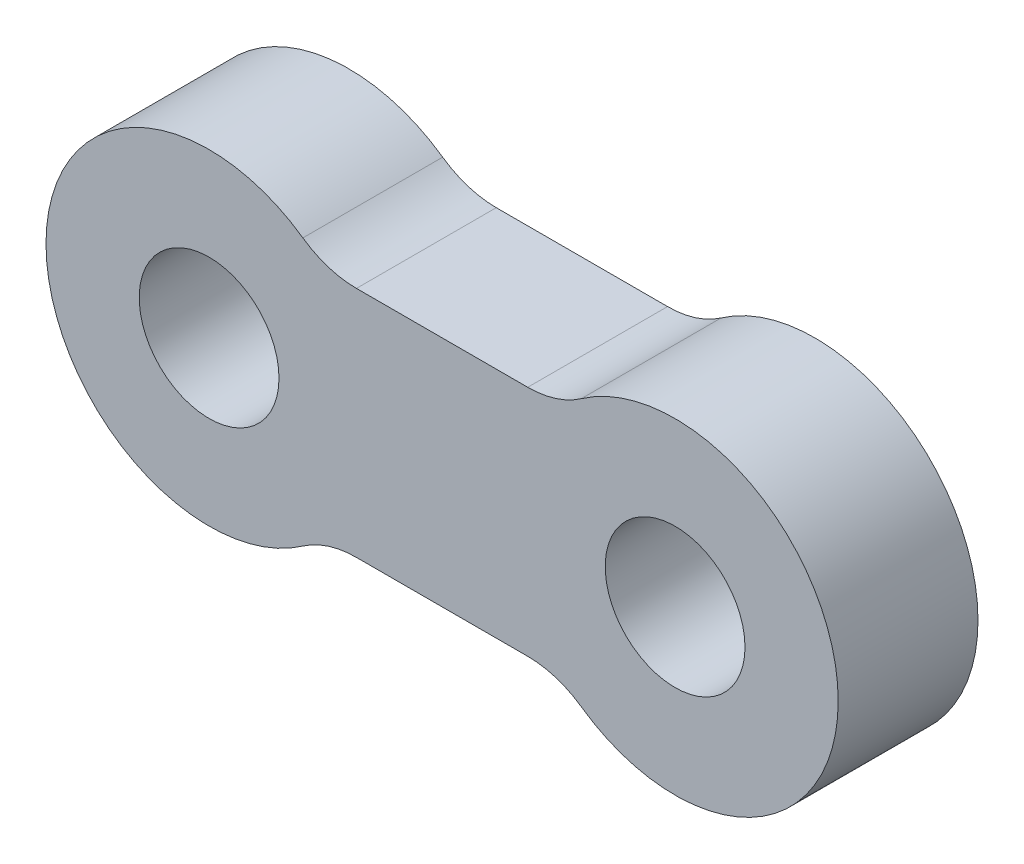
ISO-10303-21;
HEADER;
FILE_DESCRIPTION(('STEP AP214'),'2;1');
FILE_NAME('part.step','',(''),(''),'','','');
FILE_SCHEMA(('AUTOMOTIVE_DESIGN { 1 0 10303 214 1 1 1 1 }'));
ENDSEC;
DATA;
#1=APPLICATION_CONTEXT('core data for automotive mechanical design processes');
#2=APPLICATION_PROTOCOL_DEFINITION('international standard','automotive_design',2000,#1);
#3=PRODUCT_CONTEXT('',#1,'mechanical');
#4=PRODUCT('Part','Part','',(#3));
#5=PRODUCT_RELATED_PRODUCT_CATEGORY('part','',(#4));
#6=PRODUCT_DEFINITION_FORMATION('','',#4);
#7=PRODUCT_DEFINITION_CONTEXT('part definition',#1,'design');
#8=PRODUCT_DEFINITION('design','',#6,#7);
#9=PRODUCT_DEFINITION_SHAPE('','',#8);
#10=(LENGTH_UNIT() NAMED_UNIT(*) SI_UNIT(.MILLI.,.METRE.));
#11=(NAMED_UNIT(*) PLANE_ANGLE_UNIT() SI_UNIT($,.RADIAN.));
#12=(NAMED_UNIT(*) SI_UNIT($,.STERADIAN.) SOLID_ANGLE_UNIT());
#13=UNCERTAINTY_MEASURE_WITH_UNIT(LENGTH_MEASURE(1.E-05),#10,'distance_accuracy_value','');
#14=(GEOMETRIC_REPRESENTATION_CONTEXT(3) GLOBAL_UNCERTAINTY_ASSIGNED_CONTEXT((#13)) GLOBAL_UNIT_ASSIGNED_CONTEXT((#10,
#11,#12)) REPRESENTATION_CONTEXT('',''));
#15=CARTESIAN_POINT('',(0.,0.,0.));
#16=DIRECTION('',(0.,0.,1.));
#17=DIRECTION('',(1.,0.,0.));
#18=AXIS2_PLACEMENT_3D('',#15,#16,#17);
#19=CARTESIAN_POINT('',(6.83772233983162,-4.5,3.));
#20=DIRECTION('',(0.,0.,-1.));
#21=DIRECTION('',(-1.,0.,0.));
#22=AXIS2_PLACEMENT_3D('',#19,#20,#21);
#23=PLANE('',#22);
#24=CARTESIAN_POINT('',(6.83772233983162,-4.5,3.));
#25=DIRECTION('',(0.,0.,-1.));
#26=DIRECTION('',(-1.,0.,0.));
#27=AXIS2_PLACEMENT_3D('',#24,#25,#26);
#28=CIRCLE('',#27,2.);
#29=CARTESIAN_POINT('',(6.83772233983162,-2.5,3.));
#30=VERTEX_POINT('',#29);
#31=CARTESIAN_POINT('',(7.98764148898376,-2.86363636363636,3.));
#32=VERTEX_POINT('',#31);
#33=EDGE_CURVE('E147',#30,#32,#28,.T.);
#34=ORIENTED_EDGE('',*,*,#33,.T.);
#35=CARTESIAN_POINT('',(10.,0.,3.));
#36=DIRECTION('',(0.,0.,1.));
#37=DIRECTION('',(-1.,0.,0.));
#38=AXIS2_PLACEMENT_3D('',#35,#36,#37);
#39=CIRCLE('',#38,3.5);
#40=CARTESIAN_POINT('',(7.98764148898376,2.86363636363637,3.));
#41=VERTEX_POINT('',#40);
#42=EDGE_CURVE('E95',#32,#41,#39,.T.);
#43=ORIENTED_EDGE('',*,*,#42,.T.);
#44=CARTESIAN_POINT('',(6.83772233983162,4.5,3.));
#45=DIRECTION('',(0.,0.,-1.));
#46=DIRECTION('',(-1.,0.,0.));
#47=AXIS2_PLACEMENT_3D('',#44,#45,#46);
#48=CIRCLE('',#47,2.);
#49=CARTESIAN_POINT('',(6.83772233983162,2.5,3.));
#50=VERTEX_POINT('',#49);
#51=EDGE_CURVE('E162',#41,#50,#48,.T.);
#52=ORIENTED_EDGE('',*,*,#51,.T.);
#53=DIRECTION('',(-1.,0.,0.));
#54=VECTOR('',#53,1.);
#55=CARTESIAN_POINT('',(3.16227766016838,2.5,3.));
#56=LINE('',#55,#54);
#57=CARTESIAN_POINT('',(3.16227766016838,2.5,3.));
#58=VERTEX_POINT('',#57);
#59=EDGE_CURVE('E175',#50,#58,#56,.T.);
#60=ORIENTED_EDGE('',*,*,#59,.T.);
#61=CARTESIAN_POINT('',(3.16227766016838,4.5,3.));
#62=DIRECTION('',(0.,0.,-1.));
#63=DIRECTION('',(-1.,0.,0.));
#64=AXIS2_PLACEMENT_3D('',#61,#62,#63);
#65=CIRCLE('',#64,2.);
#66=CARTESIAN_POINT('',(2.01235851101624,2.86363636363636,3.));
#67=VERTEX_POINT('',#66);
#68=EDGE_CURVE('E114',#58,#67,#65,.T.);
#69=ORIENTED_EDGE('',*,*,#68,.T.);
#70=CARTESIAN_POINT('',(0.,0.,3.));
#71=DIRECTION('',(0.,0.,1.));
#72=DIRECTION('',(1.,0.,0.));
#73=AXIS2_PLACEMENT_3D('',#70,#71,#72);
#74=CIRCLE('',#73,3.5);
#75=CARTESIAN_POINT('',(2.01235851101624,-2.86363636363636,3.));
#76=VERTEX_POINT('',#75);
#77=EDGE_CURVE('E108',#67,#76,#74,.T.);
#78=ORIENTED_EDGE('',*,*,#77,.T.);
#79=CARTESIAN_POINT('',(3.16227766016838,-4.5,3.));
#80=DIRECTION('',(0.,0.,-1.));
#81=DIRECTION('',(1.,0.,0.));
#82=AXIS2_PLACEMENT_3D('',#79,#80,#81);
#83=CIRCLE('',#82,2.);
#84=CARTESIAN_POINT('',(3.16227766016838,-2.5,3.));
#85=VERTEX_POINT('',#84);
#86=EDGE_CURVE('E112',#76,#85,#83,.T.);
#87=ORIENTED_EDGE('',*,*,#86,.T.);
#88=DIRECTION('',(1.,0.,0.));
#89=VECTOR('',#88,1.);
#90=CARTESIAN_POINT('',(3.16227766016838,-2.5,3.));
#91=LINE('',#90,#89);
#92=EDGE_CURVE('E52',#85,#30,#91,.T.);
#93=ORIENTED_EDGE('',*,*,#92,.T.);
#94=EDGE_LOOP('',(#34,#43,#52,#60,#69,#78,#87,#93));
#95=FACE_BOUND('',#94,.T.);
#96=CARTESIAN_POINT('',(0.,0.,3.));
#97=DIRECTION('',(0.,0.,1.));
#98=DIRECTION('',(1.,0.,0.));
#99=AXIS2_PLACEMENT_3D('',#96,#97,#98);
#100=CIRCLE('',#99,1.5);
#101=CARTESIAN_POINT('',(1.5,0.,3.));
#102=VERTEX_POINT('',#101);
#103=EDGE_CURVE('E136',#102,#102,#100,.T.);
#104=ORIENTED_EDGE('',*,*,#103,.F.);
#105=EDGE_LOOP('',(#104));
#106=FACE_BOUND('',#105,.T.);
#107=CARTESIAN_POINT('',(10.,0.,3.));
#108=DIRECTION('',(0.,0.,1.));
#109=DIRECTION('',(1.,0.,0.));
#110=AXIS2_PLACEMENT_3D('',#107,#108,#109);
#111=CIRCLE('',#110,1.5);
#112=CARTESIAN_POINT('',(11.5,0.,3.));
#113=VERTEX_POINT('',#112);
#114=EDGE_CURVE('E184',#113,#113,#111,.T.);
#115=ORIENTED_EDGE('',*,*,#114,.F.);
#116=EDGE_LOOP('',(#115));
#117=FACE_BOUND('',#116,.T.);
#118=ADVANCED_FACE('F35',(#95,#106,#117),#23,.F.);
#119=CARTESIAN_POINT('',(6.83772233983162,-4.5,0.));
#120=DIRECTION('',(0.,0.,-1.));
#121=DIRECTION('',(-1.,0.,0.));
#122=AXIS2_PLACEMENT_3D('',#119,#120,#121);
#123=PLANE('',#122);
#124=CARTESIAN_POINT('',(0.,0.,0.));
#125=DIRECTION('',(0.,0.,1.));
#126=DIRECTION('',(1.,0.,0.));
#127=AXIS2_PLACEMENT_3D('',#124,#125,#126);
#128=CIRCLE('',#127,1.5);
#129=CARTESIAN_POINT('',(1.5,0.,0.));
#130=VERTEX_POINT('',#129);
#131=EDGE_CURVE('E181',#130,#130,#128,.T.);
#132=ORIENTED_EDGE('',*,*,#131,.T.);
#133=EDGE_LOOP('',(#132));
#134=FACE_BOUND('',#133,.T.);
#135=CARTESIAN_POINT('',(6.83772233983162,-4.5,0.));
#136=DIRECTION('',(0.,0.,-1.));
#137=DIRECTION('',(-1.,0.,0.));
#138=AXIS2_PLACEMENT_3D('',#135,#136,#137);
#139=CIRCLE('',#138,2.);
#140=CARTESIAN_POINT('',(6.83772233983162,-2.5,0.));
#141=VERTEX_POINT('',#140);
#142=CARTESIAN_POINT('',(7.98764148898376,-2.86363636363636,0.));
#143=VERTEX_POINT('',#142);
#144=EDGE_CURVE('E132',#141,#143,#139,.T.);
#145=ORIENTED_EDGE('',*,*,#144,.F.);
#146=DIRECTION('',(1.,0.,0.));
#147=VECTOR('',#146,1.);
#148=CARTESIAN_POINT('',(3.16227766016838,-2.5,0.));
#149=LINE('',#148,#147);
#150=CARTESIAN_POINT('',(3.16227766016838,-2.5,0.));
#151=VERTEX_POINT('',#150);
#152=EDGE_CURVE('E87',#151,#141,#149,.T.);
#153=ORIENTED_EDGE('',*,*,#152,.F.);
#154=CARTESIAN_POINT('',(3.16227766016838,-4.5,0.));
#155=DIRECTION('',(0.,0.,-1.));
#156=DIRECTION('',(1.,0.,0.));
#157=AXIS2_PLACEMENT_3D('',#154,#155,#156);
#158=CIRCLE('',#157,2.);
#159=CARTESIAN_POINT('',(2.01235851101624,-2.86363636363636,0.));
#160=VERTEX_POINT('',#159);
#161=EDGE_CURVE('E81',#160,#151,#158,.T.);
#162=ORIENTED_EDGE('',*,*,#161,.F.);
#163=CARTESIAN_POINT('',(0.,0.,0.));
#164=DIRECTION('',(0.,0.,1.));
#165=DIRECTION('',(1.,0.,0.));
#166=AXIS2_PLACEMENT_3D('',#163,#164,#165);
#167=CIRCLE('',#166,3.5);
#168=CARTESIAN_POINT('',(2.01235851101624,2.86363636363636,0.));
#169=VERTEX_POINT('',#168);
#170=EDGE_CURVE('E122',#169,#160,#167,.T.);
#171=ORIENTED_EDGE('',*,*,#170,.F.);
#172=CARTESIAN_POINT('',(3.16227766016838,4.5,0.));
#173=DIRECTION('',(0.,0.,-1.));
#174=DIRECTION('',(-1.,0.,0.));
#175=AXIS2_PLACEMENT_3D('',#172,#173,#174);
#176=CIRCLE('',#175,2.);
#177=CARTESIAN_POINT('',(3.16227766016838,2.5,0.));
#178=VERTEX_POINT('',#177);
#179=EDGE_CURVE('E142',#178,#169,#176,.T.);
#180=ORIENTED_EDGE('',*,*,#179,.F.);
#181=DIRECTION('',(-1.,0.,0.));
#182=VECTOR('',#181,1.);
#183=CARTESIAN_POINT('',(3.16227766016838,2.5,0.));
#184=LINE('',#183,#182);
#185=CARTESIAN_POINT('',(6.83772233983162,2.5,0.));
#186=VERTEX_POINT('',#185);
#187=EDGE_CURVE('E140',#186,#178,#184,.T.);
#188=ORIENTED_EDGE('',*,*,#187,.F.);
#189=CARTESIAN_POINT('',(6.83772233983162,4.5,0.));
#190=DIRECTION('',(0.,0.,-1.));
#191=DIRECTION('',(-1.,0.,0.));
#192=AXIS2_PLACEMENT_3D('',#189,#190,#191);
#193=CIRCLE('',#192,2.);
#194=CARTESIAN_POINT('',(7.98764148898376,2.86363636363637,0.));
#195=VERTEX_POINT('',#194);
#196=EDGE_CURVE('E138',#195,#186,#193,.T.);
#197=ORIENTED_EDGE('',*,*,#196,.F.);
#198=CARTESIAN_POINT('',(10.,0.,0.));
#199=DIRECTION('',(0.,0.,1.));
#200=DIRECTION('',(-1.,0.,0.));
#201=AXIS2_PLACEMENT_3D('',#198,#199,#200);
#202=CIRCLE('',#201,3.5);
#203=EDGE_CURVE('E135',#143,#195,#202,.T.);
#204=ORIENTED_EDGE('',*,*,#203,.F.);
#205=EDGE_LOOP('',(#145,#153,#162,#171,#180,#188,#197,#204));
#206=FACE_BOUND('',#205,.T.);
#207=CARTESIAN_POINT('',(10.,0.,0.));
#208=DIRECTION('',(0.,0.,1.));
#209=DIRECTION('',(1.,0.,0.));
#210=AXIS2_PLACEMENT_3D('',#207,#208,#209);
#211=CIRCLE('',#210,1.5);
#212=CARTESIAN_POINT('',(11.5,0.,0.));
#213=VERTEX_POINT('',#212);
#214=EDGE_CURVE('E187',#213,#213,#211,.T.);
#215=ORIENTED_EDGE('',*,*,#214,.T.);
#216=EDGE_LOOP('',(#215));
#217=FACE_BOUND('',#216,.T.);
#218=ADVANCED_FACE('F166',(#134,#206,#217),#123,.T.);
#219=CARTESIAN_POINT('',(6.83772233983162,-4.5,3.));
#220=DIRECTION('',(0.,0.,-1.));
#221=DIRECTION('',(-1.,0.,0.));
#222=AXIS2_PLACEMENT_3D('',#219,#220,#221);
#223=CYLINDRICAL_SURFACE('',#222,2.);
#224=ORIENTED_EDGE('',*,*,#144,.T.);
#225=DIRECTION('',(0.,0.,-1.));
#226=VECTOR('',#225,1.);
#227=CARTESIAN_POINT('',(7.98764148898376,-2.86363636363636,3.));
#228=LINE('',#227,#226);
#229=EDGE_CURVE('E11',#32,#143,#228,.T.);
#230=ORIENTED_EDGE('',*,*,#229,.F.);
#231=ORIENTED_EDGE('',*,*,#33,.F.);
#232=DIRECTION('',(0.,0.,-1.));
#233=VECTOR('',#232,1.);
#234=CARTESIAN_POINT('',(6.83772233983162,-2.5,3.));
#235=LINE('',#234,#233);
#236=EDGE_CURVE('E128',#30,#141,#235,.T.);
#237=ORIENTED_EDGE('',*,*,#236,.T.);
#238=EDGE_LOOP('',(#224,#230,#231,#237));
#239=FACE_BOUND('',#238,.T.);
#240=ADVANCED_FACE('F37',(#239),#223,.F.);
#241=CARTESIAN_POINT('',(10.,0.,3.));
#242=DIRECTION('',(0.,0.,-1.));
#243=DIRECTION('',(-1.,0.,0.));
#244=AXIS2_PLACEMENT_3D('',#241,#242,#243);
#245=CYLINDRICAL_SURFACE('',#244,3.5);
#246=ORIENTED_EDGE('',*,*,#203,.T.);
#247=DIRECTION('',(0.,0.,-1.));
#248=VECTOR('',#247,1.);
#249=CARTESIAN_POINT('',(7.98764148898376,2.86363636363637,3.));
#250=LINE('',#249,#248);
#251=EDGE_CURVE('E44',#41,#195,#250,.T.);
#252=ORIENTED_EDGE('',*,*,#251,.F.);
#253=ORIENTED_EDGE('',*,*,#42,.F.);
#254=ORIENTED_EDGE('',*,*,#229,.T.);
#255=EDGE_LOOP('',(#246,#252,#253,#254));
#256=FACE_BOUND('',#255,.T.);
#257=ADVANCED_FACE('F219',(#256),#245,.T.);
#258=CARTESIAN_POINT('',(6.83772233983162,4.5,3.));
#259=DIRECTION('',(0.,0.,-1.));
#260=DIRECTION('',(-1.,0.,0.));
#261=AXIS2_PLACEMENT_3D('',#258,#259,#260);
#262=CYLINDRICAL_SURFACE('',#261,2.);
#263=ORIENTED_EDGE('',*,*,#196,.T.);
#264=DIRECTION('',(0.,0.,-1.));
#265=VECTOR('',#264,1.);
#266=CARTESIAN_POINT('',(6.83772233983162,2.5,3.));
#267=LINE('',#266,#265);
#268=EDGE_CURVE('E154',#50,#186,#267,.T.);
#269=ORIENTED_EDGE('',*,*,#268,.F.);
#270=ORIENTED_EDGE('',*,*,#51,.F.);
#271=ORIENTED_EDGE('',*,*,#251,.T.);
#272=EDGE_LOOP('',(#263,#269,#270,#271));
#273=FACE_BOUND('',#272,.T.);
#274=ADVANCED_FACE('F160',(#273),#262,.F.);
#275=CARTESIAN_POINT('',(3.16227766016838,2.5,3.));
#276=DIRECTION('',(0.,-1.,0.));
#277=DIRECTION('',(1.,0.,0.));
#278=AXIS2_PLACEMENT_3D('',#275,#276,#277);
#279=PLANE('',#278);
#280=ORIENTED_EDGE('',*,*,#187,.T.);
#281=DIRECTION('',(0.,0.,-1.));
#282=VECTOR('',#281,1.);
#283=CARTESIAN_POINT('',(3.16227766016838,2.5,3.));
#284=LINE('',#283,#282);
#285=EDGE_CURVE('E151',#58,#178,#284,.T.);
#286=ORIENTED_EDGE('',*,*,#285,.F.);
#287=ORIENTED_EDGE('',*,*,#59,.F.);
#288=ORIENTED_EDGE('',*,*,#268,.T.);
#289=EDGE_LOOP('',(#280,#286,#287,#288));
#290=FACE_BOUND('',#289,.T.);
#291=ADVANCED_FACE('F171',(#290),#279,.F.);
#292=CARTESIAN_POINT('',(3.16227766016838,4.5,3.));
#293=DIRECTION('',(0.,0.,-1.));
#294=DIRECTION('',(-1.,0.,0.));
#295=AXIS2_PLACEMENT_3D('',#292,#293,#294);
#296=CYLINDRICAL_SURFACE('',#295,2.);
#297=ORIENTED_EDGE('',*,*,#179,.T.);
#298=DIRECTION('',(0.,0.,-1.));
#299=VECTOR('',#298,1.);
#300=CARTESIAN_POINT('',(2.01235851101624,2.86363636363636,3.));
#301=LINE('',#300,#299);
#302=EDGE_CURVE('E123',#67,#169,#301,.T.);
#303=ORIENTED_EDGE('',*,*,#302,.F.);
#304=ORIENTED_EDGE('',*,*,#68,.F.);
#305=ORIENTED_EDGE('',*,*,#285,.T.);
#306=EDGE_LOOP('',(#297,#303,#304,#305));
#307=FACE_BOUND('',#306,.T.);
#308=ADVANCED_FACE('F174',(#307),#296,.F.);
#309=CARTESIAN_POINT('',(0.,0.,3.));
#310=DIRECTION('',(0.,0.,-1.));
#311=DIRECTION('',(-1.,0.,0.));
#312=AXIS2_PLACEMENT_3D('',#309,#310,#311);
#313=CYLINDRICAL_SURFACE('',#312,3.5);
#314=ORIENTED_EDGE('',*,*,#170,.T.);
#315=DIRECTION('',(0.,0.,-1.));
#316=VECTOR('',#315,1.);
#317=CARTESIAN_POINT('',(2.01235851101624,-2.86363636363636,3.));
#318=LINE('',#317,#316);
#319=EDGE_CURVE('E119',#76,#160,#318,.T.);
#320=ORIENTED_EDGE('',*,*,#319,.F.);
#321=ORIENTED_EDGE('',*,*,#77,.F.);
#322=ORIENTED_EDGE('',*,*,#302,.T.);
#323=EDGE_LOOP('',(#314,#320,#321,#322));
#324=FACE_BOUND('',#323,.T.);
#325=ADVANCED_FACE('F120',(#324),#313,.T.);
#326=CARTESIAN_POINT('',(3.16227766016838,-4.5,3.));
#327=DIRECTION('',(0.,0.,-1.));
#328=DIRECTION('',(-1.,0.,0.));
#329=AXIS2_PLACEMENT_3D('',#326,#327,#328);
#330=CYLINDRICAL_SURFACE('',#329,2.);
#331=ORIENTED_EDGE('',*,*,#161,.T.);
#332=DIRECTION('',(0.,0.,-1.));
#333=VECTOR('',#332,1.);
#334=CARTESIAN_POINT('',(3.16227766016838,-2.5,3.));
#335=LINE('',#334,#333);
#336=EDGE_CURVE('E124',#85,#151,#335,.T.);
#337=ORIENTED_EDGE('',*,*,#336,.F.);
#338=ORIENTED_EDGE('',*,*,#86,.F.);
#339=ORIENTED_EDGE('',*,*,#319,.T.);
#340=EDGE_LOOP('',(#331,#337,#338,#339));
#341=FACE_BOUND('',#340,.T.);
#342=ADVANCED_FACE('F126',(#341),#330,.F.);
#343=CARTESIAN_POINT('',(3.16227766016838,-2.5,3.));
#344=DIRECTION('',(0.,1.,0.));
#345=DIRECTION('',(-1.,0.,0.));
#346=AXIS2_PLACEMENT_3D('',#343,#344,#345);
#347=PLANE('',#346);
#348=ORIENTED_EDGE('',*,*,#152,.T.);
#349=ORIENTED_EDGE('',*,*,#236,.F.);
#350=ORIENTED_EDGE('',*,*,#92,.F.);
#351=ORIENTED_EDGE('',*,*,#336,.T.);
#352=EDGE_LOOP('',(#348,#349,#350,#351));
#353=FACE_BOUND('',#352,.T.);
#354=ADVANCED_FACE('F207',(#353),#347,.F.);
#355=CARTESIAN_POINT('',(0.,0.,3.));
#356=DIRECTION('',(0.,0.,-1.));
#357=DIRECTION('',(-1.,0.,0.));
#358=AXIS2_PLACEMENT_3D('',#355,#356,#357);
#359=CYLINDRICAL_SURFACE('',#358,1.5);
#360=ORIENTED_EDGE('',*,*,#103,.T.);
#361=EDGE_LOOP('',(#360));
#362=FACE_BOUND('',#361,.T.);
#363=ORIENTED_EDGE('',*,*,#131,.F.);
#364=EDGE_LOOP('',(#363));
#365=FACE_BOUND('',#364,.T.);
#366=ADVANCED_FACE('F204',(#362,#365),#359,.F.);
#367=CARTESIAN_POINT('',(10.,0.,3.));
#368=DIRECTION('',(0.,0.,-1.));
#369=DIRECTION('',(-1.,0.,0.));
#370=AXIS2_PLACEMENT_3D('',#367,#368,#369);
#371=CYLINDRICAL_SURFACE('',#370,1.5);
#372=ORIENTED_EDGE('',*,*,#114,.T.);
#373=EDGE_LOOP('',(#372));
#374=FACE_BOUND('',#373,.T.);
#375=ORIENTED_EDGE('',*,*,#214,.F.);
#376=EDGE_LOOP('',(#375));
#377=FACE_BOUND('',#376,.T.);
#378=ADVANCED_FACE('F193',(#374,#377),#371,.F.);
#379=CLOSED_SHELL('',(#118,#218,#240,#257,#274,#291,#308,#325,#342,#354,#366,#378));
#380=MANIFOLD_SOLID_BREP('B2',#379);
#381=ADVANCED_BREP_SHAPE_REPRESENTATION('',(#18,#380),#14);
#382=SHAPE_DEFINITION_REPRESENTATION(#9,#381);
ENDSEC;
END-ISO-10303-21;
